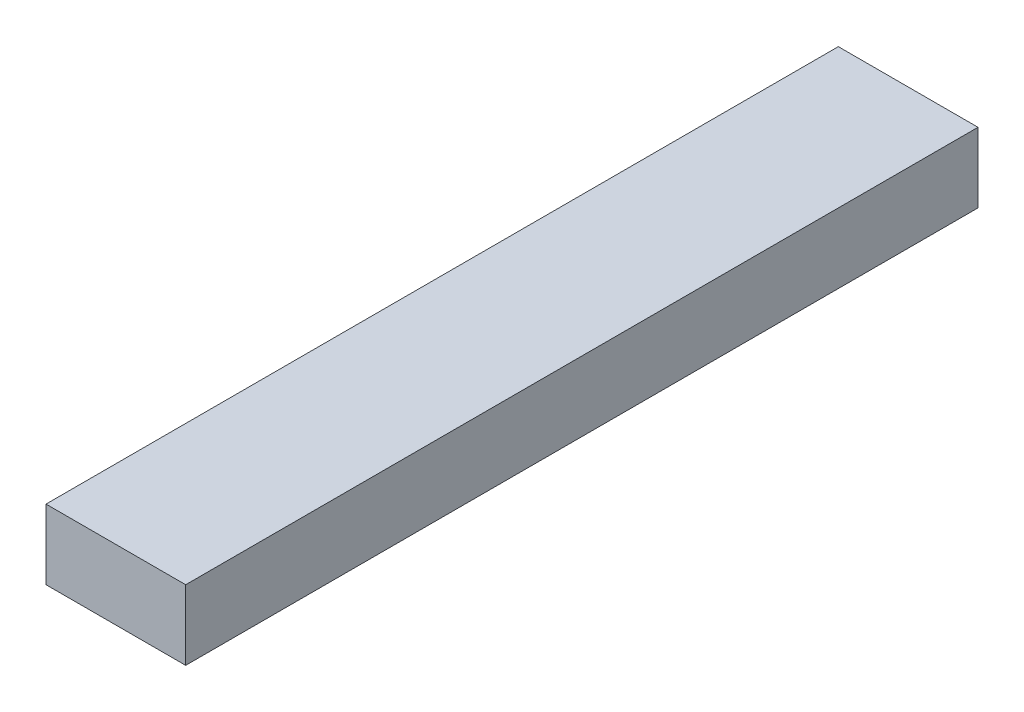
ISO-10303-21;
HEADER;
FILE_DESCRIPTION(('STEP AP214'),'2;1');
FILE_NAME('part.step','',(''),(''),'','','');
FILE_SCHEMA(('AUTOMOTIVE_DESIGN { 1 0 10303 214 1 1 1 1 }'));
ENDSEC;
DATA;
#1=APPLICATION_CONTEXT('core data for automotive mechanical design processes');
#2=APPLICATION_PROTOCOL_DEFINITION('international standard','automotive_design',2000,#1);
#3=PRODUCT_CONTEXT('',#1,'mechanical');
#4=PRODUCT('Part','Part','',(#3));
#5=PRODUCT_RELATED_PRODUCT_CATEGORY('part','',(#4));
#6=PRODUCT_DEFINITION_FORMATION('','',#4);
#7=PRODUCT_DEFINITION_CONTEXT('part definition',#1,'design');
#8=PRODUCT_DEFINITION('design','',#6,#7);
#9=PRODUCT_DEFINITION_SHAPE('','',#8);
#10=(LENGTH_UNIT() NAMED_UNIT(*) SI_UNIT(.MILLI.,.METRE.));
#11=(NAMED_UNIT(*) PLANE_ANGLE_UNIT() SI_UNIT($,.RADIAN.));
#12=(NAMED_UNIT(*) SI_UNIT($,.STERADIAN.) SOLID_ANGLE_UNIT());
#13=UNCERTAINTY_MEASURE_WITH_UNIT(LENGTH_MEASURE(1.E-05),#10,'distance_accuracy_value','');
#14=(GEOMETRIC_REPRESENTATION_CONTEXT(3) GLOBAL_UNCERTAINTY_ASSIGNED_CONTEXT((#13)) GLOBAL_UNIT_ASSIGNED_CONTEXT((#10,
#11,#12)) REPRESENTATION_CONTEXT('',''));
#15=CARTESIAN_POINT('',(0.,0.,0.));
#16=DIRECTION('',(0.,0.,1.));
#17=DIRECTION('',(1.,0.,0.));
#18=AXIS2_PLACEMENT_3D('',#15,#16,#17);
#19=CARTESIAN_POINT('',(4.3118203225697,3.6056,0.194795322569653));
#20=DIRECTION('',(-1.,0.,0.));
#21=DIRECTION('',(0.,0.,1.));
#22=AXIS2_PLACEMENT_3D('',#19,#20,#21);
#23=PLANE('',#22);
#24=DIRECTION('',(0.,0.,1.));
#25=VECTOR('',#24,1.);
#26=CARTESIAN_POINT('',(4.3118203225697,3.7056,0.194795322569653));
#27=LINE('',#26,#25);
#28=CARTESIAN_POINT('',(4.3118203225697,3.7056,0.194795322569653));
#29=VERTEX_POINT('',#28);
#30=CARTESIAN_POINT('',(4.3118203225697,3.7056,1.3292546774303));
#31=VERTEX_POINT('',#30);
#32=EDGE_CURVE('E11',#29,#31,#27,.T.);
#33=ORIENTED_EDGE('',*,*,#32,.F.);
#34=DIRECTION('',(0.,1.,0.));
#35=VECTOR('',#34,1.);
#36=CARTESIAN_POINT('',(4.3118203225697,3.6056,0.194795322569653));
#37=LINE('',#36,#35);
#38=CARTESIAN_POINT('',(4.3118203225697,3.6056,0.194795322569653));
#39=VERTEX_POINT('',#38);
#40=EDGE_CURVE('E24',#39,#29,#37,.T.);
#41=ORIENTED_EDGE('',*,*,#40,.F.);
#42=DIRECTION('',(0.,0.,1.));
#43=VECTOR('',#42,1.);
#44=CARTESIAN_POINT('',(4.3118203225697,3.6056,0.194795322569653));
#45=LINE('',#44,#43);
#46=CARTESIAN_POINT('',(4.3118203225697,3.6056,1.3292546774303));
#47=VERTEX_POINT('',#46);
#48=EDGE_CURVE('E88',#39,#47,#45,.T.);
#49=ORIENTED_EDGE('',*,*,#48,.T.);
#50=DIRECTION('',(0.,1.,0.));
#51=VECTOR('',#50,1.);
#52=CARTESIAN_POINT('',(4.3118203225697,3.6056,1.3292546774303));
#53=LINE('',#52,#51);
#54=EDGE_CURVE('E77',#47,#31,#53,.T.);
#55=ORIENTED_EDGE('',*,*,#54,.T.);
#56=EDGE_LOOP('',(#33,#41,#49,#55));
#57=FACE_BOUND('',#56,.T.);
#58=ADVANCED_FACE('F17',(#57),#23,.T.);
#59=CARTESIAN_POINT('',(4.3118203225697,3.6056,0.194795322569653));
#60=DIRECTION('',(0.,0.,-1.));
#61=DIRECTION('',(0.,1.,0.));
#62=AXIS2_PLACEMENT_3D('',#59,#60,#61);
#63=PLANE('',#62);
#64=DIRECTION('',(-1.,0.,0.));
#65=VECTOR('',#64,1.);
#66=CARTESIAN_POINT('',(4.3118203225697,3.7056,0.194795322569653));
#67=LINE('',#66,#65);
#68=CARTESIAN_POINT('',(4.5118203225697,3.7056,0.194795322569653));
#69=VERTEX_POINT('',#68);
#70=EDGE_CURVE('E85',#69,#29,#67,.T.);
#71=ORIENTED_EDGE('',*,*,#70,.F.);
#72=DIRECTION('',(0.,1.,0.));
#73=VECTOR('',#72,1.);
#74=CARTESIAN_POINT('',(4.5118203225697,3.6056,0.194795322569653));
#75=LINE('',#74,#73);
#76=CARTESIAN_POINT('',(4.5118203225697,3.6056,0.194795322569653));
#77=VERTEX_POINT('',#76);
#78=EDGE_CURVE('E83',#77,#69,#75,.T.);
#79=ORIENTED_EDGE('',*,*,#78,.F.);
#80=DIRECTION('',(-1.,0.,0.));
#81=VECTOR('',#80,1.);
#82=CARTESIAN_POINT('',(4.3118203225697,3.6056,0.194795322569653));
#83=LINE('',#82,#81);
#84=EDGE_CURVE('E72',#77,#39,#83,.T.);
#85=ORIENTED_EDGE('',*,*,#84,.T.);
#86=ORIENTED_EDGE('',*,*,#40,.T.);
#87=EDGE_LOOP('',(#71,#79,#85,#86));
#88=FACE_BOUND('',#87,.T.);
#89=ADVANCED_FACE('F90',(#88),#63,.T.);
#90=CARTESIAN_POINT('',(4.5118203225697,3.6056,0.194795322569653));
#91=DIRECTION('',(1.,0.,0.));
#92=DIRECTION('',(0.,0.,-1.));
#93=AXIS2_PLACEMENT_3D('',#90,#91,#92);
#94=PLANE('',#93);
#95=DIRECTION('',(0.,0.,-1.));
#96=VECTOR('',#95,1.);
#97=CARTESIAN_POINT('',(4.5118203225697,3.7056,0.194795322569653));
#98=LINE('',#97,#96);
#99=CARTESIAN_POINT('',(4.5118203225697,3.7056,1.3292546774303));
#100=VERTEX_POINT('',#99);
#101=EDGE_CURVE('E60',#100,#69,#98,.T.);
#102=ORIENTED_EDGE('',*,*,#101,.F.);
#103=DIRECTION('',(0.,1.,0.));
#104=VECTOR('',#103,1.);
#105=CARTESIAN_POINT('',(4.5118203225697,3.6056,1.3292546774303));
#106=LINE('',#105,#104);
#107=CARTESIAN_POINT('',(4.5118203225697,3.6056,1.3292546774303));
#108=VERTEX_POINT('',#107);
#109=EDGE_CURVE('E54',#108,#100,#106,.T.);
#110=ORIENTED_EDGE('',*,*,#109,.F.);
#111=DIRECTION('',(0.,0.,-1.));
#112=VECTOR('',#111,1.);
#113=CARTESIAN_POINT('',(4.5118203225697,3.6056,0.194795322569653));
#114=LINE('',#113,#112);
#115=EDGE_CURVE('E58',#108,#77,#114,.T.);
#116=ORIENTED_EDGE('',*,*,#115,.T.);
#117=ORIENTED_EDGE('',*,*,#78,.T.);
#118=EDGE_LOOP('',(#102,#110,#116,#117));
#119=FACE_BOUND('',#118,.T.);
#120=ADVANCED_FACE('F56',(#119),#94,.T.);
#121=CARTESIAN_POINT('',(4.3118203225697,3.6056,1.3292546774303));
#122=DIRECTION('',(0.,0.,1.));
#123=DIRECTION('',(0.,-1.,0.));
#124=AXIS2_PLACEMENT_3D('',#121,#122,#123);
#125=PLANE('',#124);
#126=DIRECTION('',(1.,0.,0.));
#127=VECTOR('',#126,1.);
#128=CARTESIAN_POINT('',(4.3118203225697,3.7056,1.3292546774303));
#129=LINE('',#128,#127);
#130=EDGE_CURVE('E73',#31,#100,#129,.T.);
#131=ORIENTED_EDGE('',*,*,#130,.F.);
#132=ORIENTED_EDGE('',*,*,#54,.F.);
#133=DIRECTION('',(1.,0.,0.));
#134=VECTOR('',#133,1.);
#135=CARTESIAN_POINT('',(4.3118203225697,3.6056,1.3292546774303));
#136=LINE('',#135,#134);
#137=EDGE_CURVE('E70',#47,#108,#136,.T.);
#138=ORIENTED_EDGE('',*,*,#137,.T.);
#139=ORIENTED_EDGE('',*,*,#109,.T.);
#140=EDGE_LOOP('',(#131,#132,#138,#139));
#141=FACE_BOUND('',#140,.T.);
#142=ADVANCED_FACE('F76',(#141),#125,.T.);
#143=CARTESIAN_POINT('',(5.22905,3.6056,0.762024999999995));
#144=DIRECTION('',(0.,1.,0.));
#145=DIRECTION('',(0.,0.,1.));
#146=AXIS2_PLACEMENT_3D('',#143,#144,#145);
#147=PLANE('',#146);
#148=ORIENTED_EDGE('',*,*,#48,.F.);
#149=ORIENTED_EDGE('',*,*,#84,.F.);
#150=ORIENTED_EDGE('',*,*,#115,.F.);
#151=ORIENTED_EDGE('',*,*,#137,.F.);
#152=EDGE_LOOP('',(#148,#149,#150,#151));
#153=FACE_BOUND('',#152,.T.);
#154=ADVANCED_FACE('F69',(#153),#147,.F.);
#155=CARTESIAN_POINT('',(5.22905,3.7056,0.762024999999995));
#156=DIRECTION('',(0.,1.,0.));
#157=DIRECTION('',(0.,0.,1.));
#158=AXIS2_PLACEMENT_3D('',#155,#156,#157);
#159=PLANE('',#158);
#160=ORIENTED_EDGE('',*,*,#32,.T.);
#161=ORIENTED_EDGE('',*,*,#130,.T.);
#162=ORIENTED_EDGE('',*,*,#101,.T.);
#163=ORIENTED_EDGE('',*,*,#70,.T.);
#164=EDGE_LOOP('',(#160,#161,#162,#163));
#165=FACE_BOUND('',#164,.T.);
#166=ADVANCED_FACE('F91',(#165),#159,.T.);
#167=CLOSED_SHELL('',(#58,#89,#120,#142,#154,#166));
#168=MANIFOLD_SOLID_BREP('B1',#167);
#169=ADVANCED_BREP_SHAPE_REPRESENTATION('',(#18,#168),#14);
#170=SHAPE_DEFINITION_REPRESENTATION(#9,#169);
ENDSEC;
END-ISO-10303-21;
